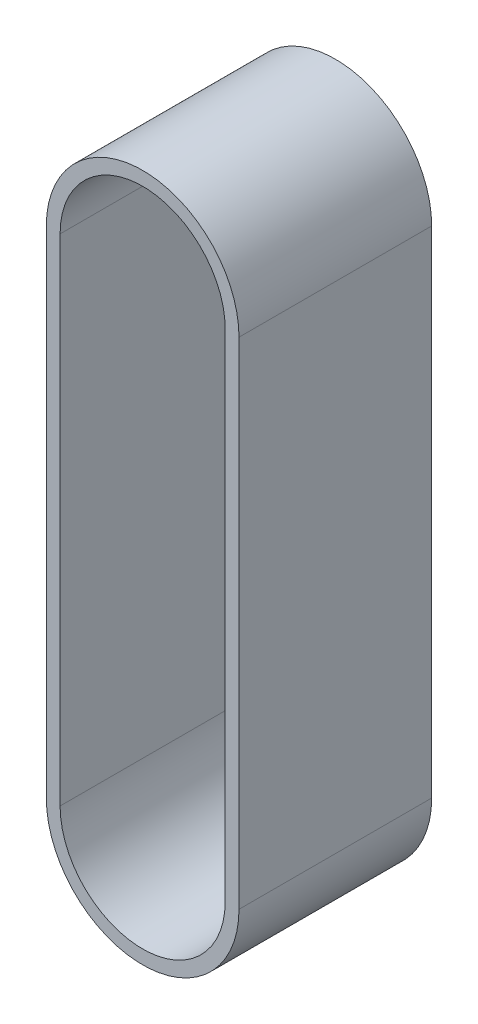
ISO-10303-21;
HEADER;
FILE_DESCRIPTION(('STEP AP214'),'2;1');
FILE_NAME('part.step','',(''),(''),'','','');
FILE_SCHEMA(('AUTOMOTIVE_DESIGN { 1 0 10303 214 1 1 1 1 }'));
ENDSEC;
DATA;
#1=APPLICATION_CONTEXT('core data for automotive mechanical design processes');
#2=APPLICATION_PROTOCOL_DEFINITION('international standard','automotive_design',2000,#1);
#3=PRODUCT_CONTEXT('',#1,'mechanical');
#4=PRODUCT('Part','Part','',(#3));
#5=PRODUCT_RELATED_PRODUCT_CATEGORY('part','',(#4));
#6=PRODUCT_DEFINITION_FORMATION('','',#4);
#7=PRODUCT_DEFINITION_CONTEXT('part definition',#1,'design');
#8=PRODUCT_DEFINITION('design','',#6,#7);
#9=PRODUCT_DEFINITION_SHAPE('','',#8);
#10=(LENGTH_UNIT() NAMED_UNIT(*) SI_UNIT(.MILLI.,.METRE.));
#11=(NAMED_UNIT(*) PLANE_ANGLE_UNIT() SI_UNIT($,.RADIAN.));
#12=(NAMED_UNIT(*) SI_UNIT($,.STERADIAN.) SOLID_ANGLE_UNIT());
#13=UNCERTAINTY_MEASURE_WITH_UNIT(LENGTH_MEASURE(1.E-05),#10,'distance_accuracy_value','');
#14=(GEOMETRIC_REPRESENTATION_CONTEXT(3) GLOBAL_UNCERTAINTY_ASSIGNED_CONTEXT((#13)) GLOBAL_UNIT_ASSIGNED_CONTEXT((#10,
#11,#12)) REPRESENTATION_CONTEXT('',''));
#15=CARTESIAN_POINT('',(0.,0.,0.));
#16=DIRECTION('',(0.,0.,1.));
#17=DIRECTION('',(1.,0.,0.));
#18=AXIS2_PLACEMENT_3D('',#15,#16,#17);
#19=CARTESIAN_POINT('',(-35.,250.,-35.));
#20=DIRECTION('',(0.,0.,1.));
#21=DIRECTION('',(1.,0.,0.));
#22=AXIS2_PLACEMENT_3D('',#19,#20,#21);
#23=PLANE('',#22);
#24=CARTESIAN_POINT('',(0.,215.,-35.));
#25=DIRECTION('',(0.,0.,1.));
#26=DIRECTION('',(1.,0.,0.));
#27=AXIS2_PLACEMENT_3D('',#24,#25,#26);
#28=CIRCLE('',#27,5.00000000000001);
#29=CARTESIAN_POINT('',(5.00000000000002,215.,-35.));
#30=VERTEX_POINT('',#29);
#31=EDGE_CURVE('E369',#30,#30,#28,.T.);
#32=ORIENTED_EDGE('',*,*,#31,.T.);
#33=EDGE_LOOP('',(#32));
#34=FACE_BOUND('',#33,.T.);
#35=CARTESIAN_POINT('',(0.,35.,-35.));
#36=DIRECTION('',(0.,0.,1.));
#37=DIRECTION('',(1.,0.,0.));
#38=AXIS2_PLACEMENT_3D('',#35,#36,#37);
#39=CIRCLE('',#38,5.);
#40=CARTESIAN_POINT('',(5.00000000000001,35.,-35.));
#41=VERTEX_POINT('',#40);
#42=EDGE_CURVE('E377',#41,#41,#39,.T.);
#43=ORIENTED_EDGE('',*,*,#42,.T.);
#44=EDGE_LOOP('',(#43));
#45=FACE_BOUND('',#44,.T.);
#46=DIRECTION('',(0.,-1.,0.));
#47=VECTOR('',#46,1.);
#48=CARTESIAN_POINT('',(-35.,250.,-35.));
#49=LINE('',#48,#47);
#50=CARTESIAN_POINT('',(-35.,215.,-35.));
#51=VERTEX_POINT('',#50);
#52=CARTESIAN_POINT('',(-35.,34.9999999999998,-35.));
#53=VERTEX_POINT('',#52);
#54=EDGE_CURVE('E253',#51,#53,#49,.T.);
#55=ORIENTED_EDGE('',*,*,#54,.F.);
#56=CARTESIAN_POINT('',(0.,215.,-35.));
#57=DIRECTION('',(0.,0.,1.));
#58=DIRECTION('',(1.,0.,0.));
#59=AXIS2_PLACEMENT_3D('',#56,#57,#58);
#60=CIRCLE('',#59,35.);
#61=CARTESIAN_POINT('',(35.,215.,-35.));
#62=VERTEX_POINT('',#61);
#63=EDGE_CURVE('E309',#62,#51,#60,.T.);
#64=ORIENTED_EDGE('',*,*,#63,.F.);
#65=DIRECTION('',(0.,-1.,0.));
#66=VECTOR('',#65,1.);
#67=CARTESIAN_POINT('',(35.,250.,-35.));
#68=LINE('',#67,#66);
#69=CARTESIAN_POINT('',(35.,35.,-35.));
#70=VERTEX_POINT('',#69);
#71=EDGE_CURVE('E13',#62,#70,#68,.T.);
#72=ORIENTED_EDGE('',*,*,#71,.T.);
#73=CARTESIAN_POINT('',(0.,35.,-35.));
#74=DIRECTION('',(0.,0.,1.));
#75=DIRECTION('',(1.,0.,0.));
#76=AXIS2_PLACEMENT_3D('',#73,#74,#75);
#77=CIRCLE('',#76,35.);
#78=EDGE_CURVE('E317',#53,#70,#77,.T.);
#79=ORIENTED_EDGE('',*,*,#78,.F.);
#80=EDGE_LOOP('',(#55,#64,#72,#79));
#81=FACE_BOUND('',#80,.T.);
#82=ADVANCED_FACE('F245',(#34,#45,#81),#23,.F.);
#83=CARTESIAN_POINT('',(35.,250.,35.));
#84=DIRECTION('',(-1.,0.,0.));
#85=DIRECTION('',(0.,0.,1.));
#86=AXIS2_PLACEMENT_3D('',#83,#84,#85);
#87=PLANE('',#86);
#88=DIRECTION('',(0.,0.,1.));
#89=VECTOR('',#88,1.);
#90=CARTESIAN_POINT('',(35.,35.,-282.38633753706));
#91=LINE('',#90,#89);
#92=CARTESIAN_POINT('',(35.,35.,35.));
#93=VERTEX_POINT('',#92);
#94=EDGE_CURVE('E334',#70,#93,#91,.T.);
#95=ORIENTED_EDGE('',*,*,#94,.F.);
#96=ORIENTED_EDGE('',*,*,#71,.F.);
#97=DIRECTION('',(0.,0.,1.));
#98=VECTOR('',#97,1.);
#99=CARTESIAN_POINT('',(35.,215.,-282.38633753706));
#100=LINE('',#99,#98);
#101=CARTESIAN_POINT('',(35.,215.,35.));
#102=VERTEX_POINT('',#101);
#103=EDGE_CURVE('E312',#62,#102,#100,.T.);
#104=ORIENTED_EDGE('',*,*,#103,.T.);
#105=DIRECTION('',(0.,-1.,0.));
#106=VECTOR('',#105,1.);
#107=CARTESIAN_POINT('',(35.,250.,35.));
#108=LINE('',#107,#106);
#109=EDGE_CURVE('E326',#102,#93,#108,.T.);
#110=ORIENTED_EDGE('',*,*,#109,.T.);
#111=EDGE_LOOP('',(#95,#96,#104,#110));
#112=FACE_BOUND('',#111,.T.);
#113=ADVANCED_FACE('F247',(#112),#87,.F.);
#114=CARTESIAN_POINT('',(-35.,250.,35.));
#115=DIRECTION('',(0.,0.,-1.));
#116=DIRECTION('',(-1.,0.,0.));
#117=AXIS2_PLACEMENT_3D('',#114,#115,#116);
#118=PLANE('',#117);
#119=CARTESIAN_POINT('',(0.,35.,35.));
#120=DIRECTION('',(0.,0.,1.));
#121=DIRECTION('',(1.,0.,0.));
#122=AXIS2_PLACEMENT_3D('',#119,#120,#121);
#123=CIRCLE('',#122,30.);
#124=CARTESIAN_POINT('',(-30.,35.,35.));
#125=VERTEX_POINT('',#124);
#126=CARTESIAN_POINT('',(30.,35.,35.));
#127=VERTEX_POINT('',#126);
#128=EDGE_CURVE('E358',#125,#127,#123,.T.);
#129=ORIENTED_EDGE('',*,*,#128,.F.);
#130=DIRECTION('',(0.,-1.,0.));
#131=VECTOR('',#130,1.);
#132=CARTESIAN_POINT('',(-30.,0.,35.));
#133=LINE('',#132,#131);
#134=CARTESIAN_POINT('',(-30.,215.,35.));
#135=VERTEX_POINT('',#134);
#136=EDGE_CURVE('E260',#135,#125,#133,.T.);
#137=ORIENTED_EDGE('',*,*,#136,.F.);
#138=CARTESIAN_POINT('',(0.,215.,35.));
#139=DIRECTION('',(0.,0.,1.));
#140=DIRECTION('',(1.,0.,0.));
#141=AXIS2_PLACEMENT_3D('',#138,#139,#140);
#142=CIRCLE('',#141,30.);
#143=CARTESIAN_POINT('',(30.,215.,35.));
#144=VERTEX_POINT('',#143);
#145=EDGE_CURVE('E346',#144,#135,#142,.T.);
#146=ORIENTED_EDGE('',*,*,#145,.F.);
#147=DIRECTION('',(0.,-1.,0.));
#148=VECTOR('',#147,1.);
#149=CARTESIAN_POINT('',(30.,0.,35.));
#150=LINE('',#149,#148);
#151=EDGE_CURVE('E355',#144,#127,#150,.T.);
#152=ORIENTED_EDGE('',*,*,#151,.T.);
#153=EDGE_LOOP('',(#129,#137,#146,#152));
#154=FACE_BOUND('',#153,.T.);
#155=ORIENTED_EDGE('',*,*,#109,.F.);
#156=CARTESIAN_POINT('',(0.,215.,35.));
#157=DIRECTION('',(0.,0.,1.));
#158=DIRECTION('',(1.,0.,0.));
#159=AXIS2_PLACEMENT_3D('',#156,#157,#158);
#160=CIRCLE('',#159,35.);
#161=CARTESIAN_POINT('',(-35.,215.,35.));
#162=VERTEX_POINT('',#161);
#163=EDGE_CURVE('E327',#102,#162,#160,.T.);
#164=ORIENTED_EDGE('',*,*,#163,.T.);
#165=DIRECTION('',(0.,-1.,0.));
#166=VECTOR('',#165,1.);
#167=CARTESIAN_POINT('',(-35.,250.,35.));
#168=LINE('',#167,#166);
#169=CARTESIAN_POINT('',(-35.,34.9999999999998,35.));
#170=VERTEX_POINT('',#169);
#171=EDGE_CURVE('E325',#162,#170,#168,.T.);
#172=ORIENTED_EDGE('',*,*,#171,.T.);
#173=CARTESIAN_POINT('',(0.,35.,35.));
#174=DIRECTION('',(0.,0.,1.));
#175=DIRECTION('',(1.,0.,0.));
#176=AXIS2_PLACEMENT_3D('',#173,#174,#175);
#177=CIRCLE('',#176,35.);
#178=EDGE_CURVE('E337',#170,#93,#177,.T.);
#179=ORIENTED_EDGE('',*,*,#178,.T.);
#180=EDGE_LOOP('',(#155,#164,#172,#179));
#181=FACE_BOUND('',#180,.T.);
#182=ADVANCED_FACE('F402',(#154,#181),#118,.F.);
#183=CARTESIAN_POINT('',(-35.,250.,35.));
#184=DIRECTION('',(1.,0.,0.));
#185=DIRECTION('',(0.,0.,-1.));
#186=AXIS2_PLACEMENT_3D('',#183,#184,#185);
#187=PLANE('',#186);
#188=DIRECTION('',(0.,0.,1.));
#189=VECTOR('',#188,1.);
#190=CARTESIAN_POINT('',(-35.,215.,-282.38633753706));
#191=LINE('',#190,#189);
#192=EDGE_CURVE('E268',#51,#162,#191,.T.);
#193=ORIENTED_EDGE('',*,*,#192,.F.);
#194=ORIENTED_EDGE('',*,*,#54,.T.);
#195=DIRECTION('',(0.,0.,1.));
#196=VECTOR('',#195,1.);
#197=CARTESIAN_POINT('',(-35.,34.9999999999998,-282.38633753706));
#198=LINE('',#197,#196);
#199=EDGE_CURVE('E316',#53,#170,#198,.T.);
#200=ORIENTED_EDGE('',*,*,#199,.T.);
#201=ORIENTED_EDGE('',*,*,#171,.F.);
#202=EDGE_LOOP('',(#193,#194,#200,#201));
#203=FACE_BOUND('',#202,.T.);
#204=ADVANCED_FACE('F321',(#203),#187,.F.);
#205=CARTESIAN_POINT('',(0.,35.,-282.38633753706));
#206=DIRECTION('',(0.,0.,1.));
#207=DIRECTION('',(1.,0.,0.));
#208=AXIS2_PLACEMENT_3D('',#205,#206,#207);
#209=CYLINDRICAL_SURFACE('',#208,35.);
#210=ORIENTED_EDGE('',*,*,#94,.T.);
#211=ORIENTED_EDGE('',*,*,#178,.F.);
#212=ORIENTED_EDGE('',*,*,#199,.F.);
#213=ORIENTED_EDGE('',*,*,#78,.T.);
#214=EDGE_LOOP('',(#210,#211,#212,#213));
#215=FACE_BOUND('',#214,.T.);
#216=ADVANCED_FACE('F430',(#215),#209,.T.);
#217=CARTESIAN_POINT('',(0.,215.,-282.38633753706));
#218=DIRECTION('',(0.,0.,1.));
#219=DIRECTION('',(1.,0.,0.));
#220=AXIS2_PLACEMENT_3D('',#217,#218,#219);
#221=CYLINDRICAL_SURFACE('',#220,35.);
#222=ORIENTED_EDGE('',*,*,#192,.T.);
#223=ORIENTED_EDGE('',*,*,#163,.F.);
#224=ORIENTED_EDGE('',*,*,#103,.F.);
#225=ORIENTED_EDGE('',*,*,#63,.T.);
#226=EDGE_LOOP('',(#222,#223,#224,#225));
#227=FACE_BOUND('',#226,.T.);
#228=ADVANCED_FACE('F310',(#227),#221,.T.);
#229=CARTESIAN_POINT('',(-30.,0.,-282.38633753706));
#230=DIRECTION('',(-1.,0.,0.));
#231=DIRECTION('',(0.,-1.,0.));
#232=AXIS2_PLACEMENT_3D('',#229,#230,#231);
#233=PLANE('',#232);
#234=DIRECTION('',(0.,1.,0.));
#235=VECTOR('',#234,1.);
#236=CARTESIAN_POINT('',(-30.,0.,-30.));
#237=LINE('',#236,#235);
#238=CARTESIAN_POINT('',(-30.,35.,-30.));
#239=VERTEX_POINT('',#238);
#240=CARTESIAN_POINT('',(-30.,215.,-30.));
#241=VERTEX_POINT('',#240);
#242=EDGE_CURVE('E342',#239,#241,#237,.T.);
#243=ORIENTED_EDGE('',*,*,#242,.T.);
#244=DIRECTION('',(0.,0.,1.));
#245=VECTOR('',#244,1.);
#246=CARTESIAN_POINT('',(-30.,215.,-282.38633753706));
#247=LINE('',#246,#245);
#248=EDGE_CURVE('E350',#241,#135,#247,.T.);
#249=ORIENTED_EDGE('',*,*,#248,.T.);
#250=ORIENTED_EDGE('',*,*,#136,.T.);
#251=DIRECTION('',(0.,0.,1.));
#252=VECTOR('',#251,1.);
#253=CARTESIAN_POINT('',(-30.,35.,-282.38633753706));
#254=LINE('',#253,#252);
#255=EDGE_CURVE('E343',#239,#125,#254,.T.);
#256=ORIENTED_EDGE('',*,*,#255,.F.);
#257=EDGE_LOOP('',(#243,#249,#250,#256));
#258=FACE_BOUND('',#257,.T.);
#259=ADVANCED_FACE('F397',(#258),#233,.F.);
#260=CARTESIAN_POINT('',(0.,215.,-282.38633753706));
#261=DIRECTION('',(0.,0.,1.));
#262=DIRECTION('',(1.,0.,0.));
#263=AXIS2_PLACEMENT_3D('',#260,#261,#262);
#264=CYLINDRICAL_SURFACE('',#263,30.);
#265=CARTESIAN_POINT('',(0.,215.,-30.));
#266=DIRECTION('',(0.,0.,1.));
#267=DIRECTION('',(1.,0.,0.));
#268=AXIS2_PLACEMENT_3D('',#265,#266,#267);
#269=CIRCLE('',#268,30.);
#270=CARTESIAN_POINT('',(30.,215.,-30.));
#271=VERTEX_POINT('',#270);
#272=EDGE_CURVE('E363',#241,#271,#269,.F.);
#273=ORIENTED_EDGE('',*,*,#272,.T.);
#274=DIRECTION('',(0.,0.,1.));
#275=VECTOR('',#274,1.);
#276=CARTESIAN_POINT('',(30.,215.,-282.38633753706));
#277=LINE('',#276,#275);
#278=EDGE_CURVE('E348',#271,#144,#277,.T.);
#279=ORIENTED_EDGE('',*,*,#278,.T.);
#280=ORIENTED_EDGE('',*,*,#145,.T.);
#281=ORIENTED_EDGE('',*,*,#248,.F.);
#282=EDGE_LOOP('',(#273,#279,#280,#281));
#283=FACE_BOUND('',#282,.T.);
#284=ADVANCED_FACE('F410',(#283),#264,.F.);
#285=CARTESIAN_POINT('',(30.,0.,-282.38633753706));
#286=DIRECTION('',(-1.,0.,0.));
#287=DIRECTION('',(0.,0.,1.));
#288=AXIS2_PLACEMENT_3D('',#285,#286,#287);
#289=PLANE('',#288);
#290=DIRECTION('',(0.,0.,1.));
#291=VECTOR('',#290,1.);
#292=CARTESIAN_POINT('',(30.,35.,-282.38633753706));
#293=LINE('',#292,#291);
#294=CARTESIAN_POINT('',(30.,35.,-30.));
#295=VERTEX_POINT('',#294);
#296=EDGE_CURVE('E345',#295,#127,#293,.T.);
#297=ORIENTED_EDGE('',*,*,#296,.T.);
#298=ORIENTED_EDGE('',*,*,#151,.F.);
#299=ORIENTED_EDGE('',*,*,#278,.F.);
#300=DIRECTION('',(0.,1.,0.));
#301=VECTOR('',#300,1.);
#302=CARTESIAN_POINT('',(30.,0.,-30.));
#303=LINE('',#302,#301);
#304=EDGE_CURVE('E352',#295,#271,#303,.T.);
#305=ORIENTED_EDGE('',*,*,#304,.F.);
#306=EDGE_LOOP('',(#297,#298,#299,#305));
#307=FACE_BOUND('',#306,.T.);
#308=ADVANCED_FACE('F408',(#307),#289,.T.);
#309=CARTESIAN_POINT('',(0.,35.,-282.38633753706));
#310=DIRECTION('',(0.,0.,1.));
#311=DIRECTION('',(1.,0.,0.));
#312=AXIS2_PLACEMENT_3D('',#309,#310,#311);
#313=CYLINDRICAL_SURFACE('',#312,30.);
#314=CARTESIAN_POINT('',(0.,35.,-30.));
#315=DIRECTION('',(0.,0.,1.));
#316=DIRECTION('',(1.,0.,0.));
#317=AXIS2_PLACEMENT_3D('',#314,#315,#316);
#318=CIRCLE('',#317,30.);
#319=EDGE_CURVE('E340',#295,#239,#318,.F.);
#320=ORIENTED_EDGE('',*,*,#319,.T.);
#321=ORIENTED_EDGE('',*,*,#255,.T.);
#322=ORIENTED_EDGE('',*,*,#128,.T.);
#323=ORIENTED_EDGE('',*,*,#296,.F.);
#324=EDGE_LOOP('',(#320,#321,#322,#323));
#325=FACE_BOUND('',#324,.T.);
#326=ADVANCED_FACE('F389',(#325),#313,.F.);
#327=CARTESIAN_POINT('',(-35.,250.,-30.));
#328=DIRECTION('',(0.,0.,1.));
#329=DIRECTION('',(1.,0.,0.));
#330=AXIS2_PLACEMENT_3D('',#327,#328,#329);
#331=PLANE('',#330);
#332=CARTESIAN_POINT('',(0.,35.,-30.));
#333=DIRECTION('',(0.,0.,1.));
#334=DIRECTION('',(1.,0.,0.));
#335=AXIS2_PLACEMENT_3D('',#332,#333,#334);
#336=CIRCLE('',#335,5.);
#337=CARTESIAN_POINT('',(5.00000000000001,35.,-30.));
#338=VERTEX_POINT('',#337);
#339=EDGE_CURVE('E373',#338,#338,#336,.T.);
#340=ORIENTED_EDGE('',*,*,#339,.F.);
#341=EDGE_LOOP('',(#340));
#342=FACE_BOUND('',#341,.T.);
#343=CARTESIAN_POINT('',(0.,215.,-30.));
#344=DIRECTION('',(0.,0.,1.));
#345=DIRECTION('',(1.,0.,0.));
#346=AXIS2_PLACEMENT_3D('',#343,#344,#345);
#347=CIRCLE('',#346,5.00000000000001);
#348=CARTESIAN_POINT('',(5.00000000000002,215.,-30.));
#349=VERTEX_POINT('',#348);
#350=EDGE_CURVE('E372',#349,#349,#347,.T.);
#351=ORIENTED_EDGE('',*,*,#350,.F.);
#352=EDGE_LOOP('',(#351));
#353=FACE_BOUND('',#352,.T.);
#354=ORIENTED_EDGE('',*,*,#242,.F.);
#355=ORIENTED_EDGE('',*,*,#319,.F.);
#356=ORIENTED_EDGE('',*,*,#304,.T.);
#357=ORIENTED_EDGE('',*,*,#272,.F.);
#358=EDGE_LOOP('',(#354,#355,#356,#357));
#359=FACE_BOUND('',#358,.T.);
#360=ADVANCED_FACE('F385',(#342,#353,#359),#331,.T.);
#361=CARTESIAN_POINT('',(0.,215.,-35.));
#362=DIRECTION('',(0.,0.,1.));
#363=DIRECTION('',(1.,0.,0.));
#364=AXIS2_PLACEMENT_3D('',#361,#362,#363);
#365=CYLINDRICAL_SURFACE('',#364,5.00000000000001);
#366=ORIENTED_EDGE('',*,*,#31,.F.);
#367=EDGE_LOOP('',(#366));
#368=FACE_BOUND('',#367,.T.);
#369=ORIENTED_EDGE('',*,*,#350,.T.);
#370=EDGE_LOOP('',(#369));
#371=FACE_BOUND('',#370,.T.);
#372=ADVANCED_FACE('F388',(#368,#371),#365,.F.);
#373=CARTESIAN_POINT('',(0.,35.,-35.));
#374=DIRECTION('',(0.,0.,1.));
#375=DIRECTION('',(1.,0.,0.));
#376=AXIS2_PLACEMENT_3D('',#373,#374,#375);
#377=CYLINDRICAL_SURFACE('',#376,5.);
#378=ORIENTED_EDGE('',*,*,#42,.F.);
#379=EDGE_LOOP('',(#378));
#380=FACE_BOUND('',#379,.T.);
#381=ORIENTED_EDGE('',*,*,#339,.T.);
#382=EDGE_LOOP('',(#381));
#383=FACE_BOUND('',#382,.T.);
#384=ADVANCED_FACE('F383',(#380,#383),#377,.F.);
#385=CLOSED_SHELL('',(#82,#113,#182,#204,#216,#228,#259,#284,#308,#326,#360,#372,#384));
#386=MANIFOLD_SOLID_BREP('B2',#385);
#387=ADVANCED_BREP_SHAPE_REPRESENTATION('',(#18,#386),#14);
#388=SHAPE_DEFINITION_REPRESENTATION(#9,#387);
ENDSEC;
END-ISO-10303-21;
